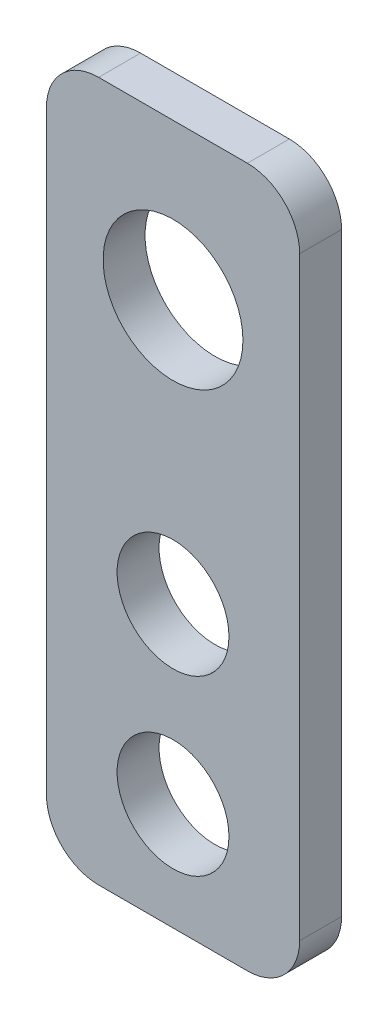
ISO-10303-21;
HEADER;
FILE_DESCRIPTION(('STEP AP214'),'2;1');
FILE_NAME('part.step','',(''),(''),'','','');
FILE_SCHEMA(('AUTOMOTIVE_DESIGN { 1 0 10303 214 1 1 1 1 }'));
ENDSEC;
DATA;
#1=APPLICATION_CONTEXT('core data for automotive mechanical design processes');
#2=APPLICATION_PROTOCOL_DEFINITION('international standard','automotive_design',2000,#1);
#3=PRODUCT_CONTEXT('',#1,'mechanical');
#4=PRODUCT('Part','Part','',(#3));
#5=PRODUCT_RELATED_PRODUCT_CATEGORY('part','',(#4));
#6=PRODUCT_DEFINITION_FORMATION('','',#4);
#7=PRODUCT_DEFINITION_CONTEXT('part definition',#1,'design');
#8=PRODUCT_DEFINITION('design','',#6,#7);
#9=PRODUCT_DEFINITION_SHAPE('','',#8);
#10=(LENGTH_UNIT() NAMED_UNIT(*) SI_UNIT(.MILLI.,.METRE.));
#11=(NAMED_UNIT(*) PLANE_ANGLE_UNIT() SI_UNIT($,.RADIAN.));
#12=(NAMED_UNIT(*) SI_UNIT($,.STERADIAN.) SOLID_ANGLE_UNIT());
#13=UNCERTAINTY_MEASURE_WITH_UNIT(LENGTH_MEASURE(1.E-05),#10,'distance_accuracy_value','');
#14=(GEOMETRIC_REPRESENTATION_CONTEXT(3) GLOBAL_UNCERTAINTY_ASSIGNED_CONTEXT((#13)) GLOBAL_UNIT_ASSIGNED_CONTEXT((#10,
#11,#12)) REPRESENTATION_CONTEXT('',''));
#15=CARTESIAN_POINT('',(0.,0.,0.));
#16=DIRECTION('',(0.,0.,1.));
#17=DIRECTION('',(1.,0.,0.));
#18=AXIS2_PLACEMENT_3D('',#15,#16,#17);
#19=CARTESIAN_POINT('',(-80.4255643742412,100.416603253089,3.));
#20=DIRECTION('',(0.,0.,1.));
#21=DIRECTION('',(1.,0.,0.));
#22=AXIS2_PLACEMENT_3D('',#19,#20,#21);
#23=PLANE('',#22);
#24=CARTESIAN_POINT('',(-75.1060983006785,116.730443274004,3.));
#25=DIRECTION('',(0.,0.,1.));
#26=DIRECTION('',(1.,0.,0.));
#27=AXIS2_PLACEMENT_3D('',#24,#25,#26);
#28=CIRCLE('',#27,4.00000000000001);
#29=CARTESIAN_POINT('',(-71.1060983006785,116.730443274004,3.));
#30=VERTEX_POINT('',#29);
#31=EDGE_CURVE('E213',#30,#30,#28,.T.);
#32=ORIENTED_EDGE('',*,*,#31,.F.);
#33=EDGE_LOOP('',(#32));
#34=FACE_BOUND('',#33,.T.);
#35=CARTESIAN_POINT('',(-80.4255643742412,100.416603253089,3.));
#36=DIRECTION('',(0.,0.,1.));
#37=DIRECTION('',(1.,0.,0.));
#38=AXIS2_PLACEMENT_3D('',#35,#36,#37);
#39=CIRCLE('',#38,3.73635693418524);
#40=CARTESIAN_POINT('',(-84.1619213084264,100.416603253089,3.));
#41=VERTEX_POINT('',#40);
#42=CARTESIAN_POINT('',(-80.4255643742412,96.6802463189038,3.));
#43=VERTEX_POINT('',#42);
#44=EDGE_CURVE('E164',#41,#43,#39,.T.);
#45=ORIENTED_EDGE('',*,*,#44,.T.);
#46=DIRECTION('',(1.,0.,0.));
#47=VECTOR('',#46,1.);
#48=CARTESIAN_POINT('',(-80.4255643742412,96.6802463189038,3.));
#49=LINE('',#48,#47);
#50=CARTESIAN_POINT('',(-69.7866322271158,96.6802463189038,3.));
#51=VERTEX_POINT('',#50);
#52=EDGE_CURVE('E100',#43,#51,#49,.T.);
#53=ORIENTED_EDGE('',*,*,#52,.T.);
#54=CARTESIAN_POINT('',(-69.7866322271158,100.416603253089,3.));
#55=DIRECTION('',(0.,0.,1.));
#56=DIRECTION('',(1.,0.,0.));
#57=AXIS2_PLACEMENT_3D('',#54,#55,#56);
#58=CIRCLE('',#57,3.73635693418525);
#59=CARTESIAN_POINT('',(-66.0502752929305,100.416603253089,3.));
#60=VERTEX_POINT('',#59);
#61=EDGE_CURVE('E185',#51,#60,#58,.T.);
#62=ORIENTED_EDGE('',*,*,#61,.T.);
#63=DIRECTION('',(0.,1.,0.));
#64=VECTOR('',#63,1.);
#65=CARTESIAN_POINT('',(-66.0502752929305,100.416603253089,3.));
#66=LINE('',#65,#64);
#67=CARTESIAN_POINT('',(-66.0502752929305,142.972331841591,3.));
#68=VERTEX_POINT('',#67);
#69=EDGE_CURVE('E199',#60,#68,#66,.T.);
#70=ORIENTED_EDGE('',*,*,#69,.T.);
#71=CARTESIAN_POINT('',(-69.7866322271157,142.972331841591,3.));
#72=DIRECTION('',(0.,0.,1.));
#73=DIRECTION('',(1.,0.,0.));
#74=AXIS2_PLACEMENT_3D('',#71,#72,#73);
#75=CIRCLE('',#74,3.73635693418525);
#76=CARTESIAN_POINT('',(-69.7866322271157,146.708688775776,3.));
#77=VERTEX_POINT('',#76);
#78=EDGE_CURVE('E119',#68,#77,#75,.T.);
#79=ORIENTED_EDGE('',*,*,#78,.T.);
#80=DIRECTION('',(-1.,0.,0.));
#81=VECTOR('',#80,1.);
#82=CARTESIAN_POINT('',(-69.7866322271157,146.708688775776,3.));
#83=LINE('',#82,#81);
#84=CARTESIAN_POINT('',(-80.4255643742411,146.708688775776,3.));
#85=VERTEX_POINT('',#84);
#86=EDGE_CURVE('E113',#77,#85,#83,.T.);
#87=ORIENTED_EDGE('',*,*,#86,.T.);
#88=CARTESIAN_POINT('',(-80.4255643742411,142.972331841591,3.));
#89=DIRECTION('',(0.,0.,1.));
#90=DIRECTION('',(1.,0.,0.));
#91=AXIS2_PLACEMENT_3D('',#88,#89,#90);
#92=CIRCLE('',#91,3.73635693418524);
#93=CARTESIAN_POINT('',(-84.1619213084263,142.972331841591,3.));
#94=VERTEX_POINT('',#93);
#95=EDGE_CURVE('E117',#85,#94,#92,.T.);
#96=ORIENTED_EDGE('',*,*,#95,.T.);
#97=DIRECTION('',(0.,-1.,0.));
#98=VECTOR('',#97,1.);
#99=CARTESIAN_POINT('',(-84.1619213084263,142.972331841591,3.));
#100=LINE('',#99,#98);
#101=EDGE_CURVE('E57',#94,#41,#100,.T.);
#102=ORIENTED_EDGE('',*,*,#101,.T.);
#103=EDGE_LOOP('',(#45,#53,#62,#70,#79,#87,#96,#102));
#104=FACE_BOUND('',#103,.T.);
#105=CARTESIAN_POINT('',(-75.1060983006785,104.343716035827,3.));
#106=DIRECTION('',(0.,0.,1.));
#107=DIRECTION('',(1.,0.,0.));
#108=AXIS2_PLACEMENT_3D('',#105,#106,#107);
#109=CIRCLE('',#108,4.00000000000001);
#110=CARTESIAN_POINT('',(-71.1060983006785,104.343716035827,3.));
#111=VERTEX_POINT('',#110);
#112=EDGE_CURVE('E146',#111,#111,#109,.T.);
#113=ORIENTED_EDGE('',*,*,#112,.F.);
#114=EDGE_LOOP('',(#113));
#115=FACE_BOUND('',#114,.T.);
#116=CARTESIAN_POINT('',(-75.1060983006785,135.579810810361,3.));
#117=DIRECTION('',(0.,0.,1.));
#118=DIRECTION('',(1.,0.,0.));
#119=AXIS2_PLACEMENT_3D('',#116,#117,#118);
#120=CIRCLE('',#119,4.99999999999999);
#121=CARTESIAN_POINT('',(-70.1060983006785,135.579810810361,3.));
#122=VERTEX_POINT('',#121);
#123=EDGE_CURVE('E221',#122,#122,#120,.T.);
#124=ORIENTED_EDGE('',*,*,#123,.F.);
#125=EDGE_LOOP('',(#124));
#126=FACE_BOUND('',#125,.T.);
#127=ADVANCED_FACE('F39',(#34,#104,#115,#126),#23,.T.);
#128=CARTESIAN_POINT('',(-80.4255643742412,100.416603253089,0.));
#129=DIRECTION('',(0.,0.,1.));
#130=DIRECTION('',(1.,0.,0.));
#131=AXIS2_PLACEMENT_3D('',#128,#129,#130);
#132=PLANE('',#131);
#133=CARTESIAN_POINT('',(-80.4255643742412,100.416603253089,0.));
#134=DIRECTION('',(0.,0.,1.));
#135=DIRECTION('',(1.,0.,0.));
#136=AXIS2_PLACEMENT_3D('',#133,#134,#135);
#137=CIRCLE('',#136,3.73635693418524);
#138=CARTESIAN_POINT('',(-84.1619213084264,100.416603253089,0.));
#139=VERTEX_POINT('',#138);
#140=CARTESIAN_POINT('',(-80.4255643742412,96.6802463189038,0.));
#141=VERTEX_POINT('',#140);
#142=EDGE_CURVE('E141',#139,#141,#137,.T.);
#143=ORIENTED_EDGE('',*,*,#142,.F.);
#144=DIRECTION('',(0.,-1.,0.));
#145=VECTOR('',#144,1.);
#146=CARTESIAN_POINT('',(-84.1619213084263,142.972331841591,0.));
#147=LINE('',#146,#145);
#148=CARTESIAN_POINT('',(-84.1619213084263,142.972331841591,0.));
#149=VERTEX_POINT('',#148);
#150=EDGE_CURVE('E92',#149,#139,#147,.T.);
#151=ORIENTED_EDGE('',*,*,#150,.F.);
#152=CARTESIAN_POINT('',(-80.4255643742411,142.972331841591,0.));
#153=DIRECTION('',(0.,0.,1.));
#154=DIRECTION('',(1.,0.,0.));
#155=AXIS2_PLACEMENT_3D('',#152,#153,#154);
#156=CIRCLE('',#155,3.73635693418524);
#157=CARTESIAN_POINT('',(-80.4255643742411,146.708688775776,0.));
#158=VERTEX_POINT('',#157);
#159=EDGE_CURVE('E86',#158,#149,#156,.T.);
#160=ORIENTED_EDGE('',*,*,#159,.F.);
#161=DIRECTION('',(-1.,0.,0.));
#162=VECTOR('',#161,1.);
#163=CARTESIAN_POINT('',(-69.7866322271157,146.708688775776,0.));
#164=LINE('',#163,#162);
#165=CARTESIAN_POINT('',(-69.7866322271157,146.708688775776,0.));
#166=VERTEX_POINT('',#165);
#167=EDGE_CURVE('E128',#166,#158,#164,.T.);
#168=ORIENTED_EDGE('',*,*,#167,.F.);
#169=CARTESIAN_POINT('',(-69.7866322271157,142.972331841591,0.));
#170=DIRECTION('',(0.,0.,1.));
#171=DIRECTION('',(1.,0.,0.));
#172=AXIS2_PLACEMENT_3D('',#169,#170,#171);
#173=CIRCLE('',#172,3.73635693418525);
#174=CARTESIAN_POINT('',(-66.0502752929305,142.972331841591,0.));
#175=VERTEX_POINT('',#174);
#176=EDGE_CURVE('E155',#175,#166,#173,.T.);
#177=ORIENTED_EDGE('',*,*,#176,.F.);
#178=DIRECTION('',(0.,1.,0.));
#179=VECTOR('',#178,1.);
#180=CARTESIAN_POINT('',(-66.0502752929305,100.416603253089,0.));
#181=LINE('',#180,#179);
#182=CARTESIAN_POINT('',(-66.0502752929305,100.416603253089,0.));
#183=VERTEX_POINT('',#182);
#184=EDGE_CURVE('E152',#183,#175,#181,.T.);
#185=ORIENTED_EDGE('',*,*,#184,.F.);
#186=CARTESIAN_POINT('',(-69.7866322271158,100.416603253089,0.));
#187=DIRECTION('',(0.,0.,1.));
#188=DIRECTION('',(1.,0.,0.));
#189=AXIS2_PLACEMENT_3D('',#186,#187,#188);
#190=CIRCLE('',#189,3.73635693418525);
#191=CARTESIAN_POINT('',(-69.7866322271158,96.6802463189038,0.));
#192=VERTEX_POINT('',#191);
#193=EDGE_CURVE('E149',#192,#183,#190,.T.);
#194=ORIENTED_EDGE('',*,*,#193,.F.);
#195=DIRECTION('',(1.,0.,0.));
#196=VECTOR('',#195,1.);
#197=CARTESIAN_POINT('',(-80.4255643742412,96.6802463189038,0.));
#198=LINE('',#197,#196);
#199=EDGE_CURVE('E145',#141,#192,#198,.T.);
#200=ORIENTED_EDGE('',*,*,#199,.F.);
#201=EDGE_LOOP('',(#143,#151,#160,#168,#177,#185,#194,#200));
#202=FACE_BOUND('',#201,.T.);
#203=CARTESIAN_POINT('',(-75.1060983006785,104.343716035827,0.));
#204=DIRECTION('',(0.,0.,1.));
#205=DIRECTION('',(1.,0.,0.));
#206=AXIS2_PLACEMENT_3D('',#203,#204,#205);
#207=CIRCLE('',#206,4.00000000000001);
#208=CARTESIAN_POINT('',(-71.1060983006785,104.343716035827,0.));
#209=VERTEX_POINT('',#208);
#210=EDGE_CURVE('E209',#209,#209,#207,.T.);
#211=ORIENTED_EDGE('',*,*,#210,.T.);
#212=EDGE_LOOP('',(#211));
#213=FACE_BOUND('',#212,.T.);
#214=CARTESIAN_POINT('',(-75.1060983006785,116.730443274004,0.));
#215=DIRECTION('',(0.,0.,1.));
#216=DIRECTION('',(1.,0.,0.));
#217=AXIS2_PLACEMENT_3D('',#214,#215,#216);
#218=CIRCLE('',#217,4.00000000000001);
#219=CARTESIAN_POINT('',(-71.1060983006785,116.730443274004,0.));
#220=VERTEX_POINT('',#219);
#221=EDGE_CURVE('E217',#220,#220,#218,.T.);
#222=ORIENTED_EDGE('',*,*,#221,.T.);
#223=EDGE_LOOP('',(#222));
#224=FACE_BOUND('',#223,.T.);
#225=CARTESIAN_POINT('',(-75.1060983006785,135.579810810361,0.));
#226=DIRECTION('',(0.,0.,1.));
#227=DIRECTION('',(1.,0.,0.));
#228=AXIS2_PLACEMENT_3D('',#225,#226,#227);
#229=CIRCLE('',#228,4.99999999999999);
#230=CARTESIAN_POINT('',(-70.1060983006785,135.579810810361,0.));
#231=VERTEX_POINT('',#230);
#232=EDGE_CURVE('E225',#231,#231,#229,.T.);
#233=ORIENTED_EDGE('',*,*,#232,.T.);
#234=EDGE_LOOP('',(#233));
#235=FACE_BOUND('',#234,.T.);
#236=ADVANCED_FACE('F189',(#202,#213,#224,#235),#132,.F.);
#237=CARTESIAN_POINT('',(-80.4255643742412,100.416603253089,3.));
#238=DIRECTION('',(0.,0.,-1.));
#239=DIRECTION('',(-1.,0.,0.));
#240=AXIS2_PLACEMENT_3D('',#237,#238,#239);
#241=CYLINDRICAL_SURFACE('',#240,3.73635693418524);
#242=ORIENTED_EDGE('',*,*,#142,.T.);
#243=DIRECTION('',(0.,0.,-1.));
#244=VECTOR('',#243,1.);
#245=CARTESIAN_POINT('',(-80.4255643742412,96.6802463189038,3.));
#246=LINE('',#245,#244);
#247=EDGE_CURVE('E11',#43,#141,#246,.T.);
#248=ORIENTED_EDGE('',*,*,#247,.F.);
#249=ORIENTED_EDGE('',*,*,#44,.F.);
#250=DIRECTION('',(0.,0.,-1.));
#251=VECTOR('',#250,1.);
#252=CARTESIAN_POINT('',(-84.1619213084264,100.416603253089,3.));
#253=LINE('',#252,#251);
#254=EDGE_CURVE('E137',#41,#139,#253,.T.);
#255=ORIENTED_EDGE('',*,*,#254,.T.);
#256=EDGE_LOOP('',(#242,#248,#249,#255));
#257=FACE_BOUND('',#256,.T.);
#258=ADVANCED_FACE('F41',(#257),#241,.T.);
#259=CARTESIAN_POINT('',(-80.4255643742412,96.6802463189038,3.));
#260=DIRECTION('',(0.,1.,0.));
#261=DIRECTION('',(-1.,0.,0.));
#262=AXIS2_PLACEMENT_3D('',#259,#260,#261);
#263=PLANE('',#262);
#264=ORIENTED_EDGE('',*,*,#199,.T.);
#265=DIRECTION('',(0.,0.,-1.));
#266=VECTOR('',#265,1.);
#267=CARTESIAN_POINT('',(-69.7866322271158,96.6802463189038,3.));
#268=LINE('',#267,#266);
#269=EDGE_CURVE('E49',#51,#192,#268,.T.);
#270=ORIENTED_EDGE('',*,*,#269,.F.);
#271=ORIENTED_EDGE('',*,*,#52,.F.);
#272=ORIENTED_EDGE('',*,*,#247,.T.);
#273=EDGE_LOOP('',(#264,#270,#271,#272));
#274=FACE_BOUND('',#273,.T.);
#275=ADVANCED_FACE('F260',(#274),#263,.F.);
#276=CARTESIAN_POINT('',(-69.7866322271158,100.416603253089,3.));
#277=DIRECTION('',(0.,0.,-1.));
#278=DIRECTION('',(-1.,0.,0.));
#279=AXIS2_PLACEMENT_3D('',#276,#277,#278);
#280=CYLINDRICAL_SURFACE('',#279,3.73635693418525);
#281=ORIENTED_EDGE('',*,*,#193,.T.);
#282=DIRECTION('',(0.,0.,-1.));
#283=VECTOR('',#282,1.);
#284=CARTESIAN_POINT('',(-66.0502752929305,100.416603253089,3.));
#285=LINE('',#284,#283);
#286=EDGE_CURVE('E175',#60,#183,#285,.T.);
#287=ORIENTED_EDGE('',*,*,#286,.F.);
#288=ORIENTED_EDGE('',*,*,#61,.F.);
#289=ORIENTED_EDGE('',*,*,#269,.T.);
#290=EDGE_LOOP('',(#281,#287,#288,#289));
#291=FACE_BOUND('',#290,.T.);
#292=ADVANCED_FACE('F183',(#291),#280,.T.);
#293=CARTESIAN_POINT('',(-66.0502752929305,100.416603253089,3.));
#294=DIRECTION('',(-1.,0.,0.));
#295=DIRECTION('',(0.,-1.,0.));
#296=AXIS2_PLACEMENT_3D('',#293,#294,#295);
#297=PLANE('',#296);
#298=ORIENTED_EDGE('',*,*,#184,.T.);
#299=DIRECTION('',(0.,0.,-1.));
#300=VECTOR('',#299,1.);
#301=CARTESIAN_POINT('',(-66.0502752929305,142.972331841591,3.));
#302=LINE('',#301,#300);
#303=EDGE_CURVE('E171',#68,#175,#302,.T.);
#304=ORIENTED_EDGE('',*,*,#303,.F.);
#305=ORIENTED_EDGE('',*,*,#69,.F.);
#306=ORIENTED_EDGE('',*,*,#286,.T.);
#307=EDGE_LOOP('',(#298,#304,#305,#306));
#308=FACE_BOUND('',#307,.T.);
#309=ADVANCED_FACE('F194',(#308),#297,.F.);
#310=CARTESIAN_POINT('',(-69.7866322271157,142.972331841591,3.));
#311=DIRECTION('',(0.,0.,-1.));
#312=DIRECTION('',(-1.,0.,0.));
#313=AXIS2_PLACEMENT_3D('',#310,#311,#312);
#314=CYLINDRICAL_SURFACE('',#313,3.73635693418525);
#315=ORIENTED_EDGE('',*,*,#176,.T.);
#316=DIRECTION('',(0.,0.,-1.));
#317=VECTOR('',#316,1.);
#318=CARTESIAN_POINT('',(-69.7866322271157,146.708688775776,3.));
#319=LINE('',#318,#317);
#320=EDGE_CURVE('E130',#77,#166,#319,.T.);
#321=ORIENTED_EDGE('',*,*,#320,.F.);
#322=ORIENTED_EDGE('',*,*,#78,.F.);
#323=ORIENTED_EDGE('',*,*,#303,.T.);
#324=EDGE_LOOP('',(#315,#321,#322,#323));
#325=FACE_BOUND('',#324,.T.);
#326=ADVANCED_FACE('F197',(#325),#314,.T.);
#327=CARTESIAN_POINT('',(-69.7866322271157,146.708688775776,3.));
#328=DIRECTION('',(0.,-1.,0.));
#329=DIRECTION('',(0.,0.,-1.));
#330=AXIS2_PLACEMENT_3D('',#327,#328,#329);
#331=PLANE('',#330);
#332=ORIENTED_EDGE('',*,*,#167,.T.);
#333=DIRECTION('',(0.,0.,-1.));
#334=VECTOR('',#333,1.);
#335=CARTESIAN_POINT('',(-80.4255643742411,146.708688775776,3.));
#336=LINE('',#335,#334);
#337=EDGE_CURVE('E125',#85,#158,#336,.T.);
#338=ORIENTED_EDGE('',*,*,#337,.F.);
#339=ORIENTED_EDGE('',*,*,#86,.F.);
#340=ORIENTED_EDGE('',*,*,#320,.T.);
#341=EDGE_LOOP('',(#332,#338,#339,#340));
#342=FACE_BOUND('',#341,.T.);
#343=ADVANCED_FACE('F126',(#342),#331,.F.);
#344=CARTESIAN_POINT('',(-80.4255643742411,142.972331841591,3.));
#345=DIRECTION('',(0.,0.,-1.));
#346=DIRECTION('',(-1.,0.,0.));
#347=AXIS2_PLACEMENT_3D('',#344,#345,#346);
#348=CYLINDRICAL_SURFACE('',#347,3.73635693418524);
#349=ORIENTED_EDGE('',*,*,#159,.T.);
#350=DIRECTION('',(0.,0.,-1.));
#351=VECTOR('',#350,1.);
#352=CARTESIAN_POINT('',(-84.1619213084263,142.972331841591,3.));
#353=LINE('',#352,#351);
#354=EDGE_CURVE('E131',#94,#149,#353,.T.);
#355=ORIENTED_EDGE('',*,*,#354,.F.);
#356=ORIENTED_EDGE('',*,*,#95,.F.);
#357=ORIENTED_EDGE('',*,*,#337,.T.);
#358=EDGE_LOOP('',(#349,#355,#356,#357));
#359=FACE_BOUND('',#358,.T.);
#360=ADVANCED_FACE('F133',(#359),#348,.T.);
#361=CARTESIAN_POINT('',(-84.1619213084263,142.972331841591,3.));
#362=DIRECTION('',(1.,0.,0.));
#363=DIRECTION('',(0.,1.,0.));
#364=AXIS2_PLACEMENT_3D('',#361,#362,#363);
#365=PLANE('',#364);
#366=ORIENTED_EDGE('',*,*,#150,.T.);
#367=ORIENTED_EDGE('',*,*,#254,.F.);
#368=ORIENTED_EDGE('',*,*,#101,.F.);
#369=ORIENTED_EDGE('',*,*,#354,.T.);
#370=EDGE_LOOP('',(#366,#367,#368,#369));
#371=FACE_BOUND('',#370,.T.);
#372=ADVANCED_FACE('F248',(#371),#365,.F.);
#373=CARTESIAN_POINT('',(-75.1060983006785,104.343716035827,3.));
#374=DIRECTION('',(0.,0.,-1.));
#375=DIRECTION('',(-1.,0.,0.));
#376=AXIS2_PLACEMENT_3D('',#373,#374,#375);
#377=CYLINDRICAL_SURFACE('',#376,4.00000000000001);
#378=ORIENTED_EDGE('',*,*,#112,.T.);
#379=EDGE_LOOP('',(#378));
#380=FACE_BOUND('',#379,.T.);
#381=ORIENTED_EDGE('',*,*,#210,.F.);
#382=EDGE_LOOP('',(#381));
#383=FACE_BOUND('',#382,.T.);
#384=ADVANCED_FACE('F245',(#380,#383),#377,.F.);
#385=CARTESIAN_POINT('',(-75.1060983006785,116.730443274004,3.));
#386=DIRECTION('',(0.,0.,-1.));
#387=DIRECTION('',(-1.,0.,0.));
#388=AXIS2_PLACEMENT_3D('',#385,#386,#387);
#389=CYLINDRICAL_SURFACE('',#388,4.00000000000001);
#390=ORIENTED_EDGE('',*,*,#31,.T.);
#391=EDGE_LOOP('',(#390));
#392=FACE_BOUND('',#391,.T.);
#393=ORIENTED_EDGE('',*,*,#221,.F.);
#394=EDGE_LOOP('',(#393));
#395=FACE_BOUND('',#394,.T.);
#396=ADVANCED_FACE('F324',(#392,#395),#389,.F.);
#397=CARTESIAN_POINT('',(-75.1060983006785,135.579810810361,3.));
#398=DIRECTION('',(0.,0.,-1.));
#399=DIRECTION('',(-1.,0.,0.));
#400=AXIS2_PLACEMENT_3D('',#397,#398,#399);
#401=CYLINDRICAL_SURFACE('',#400,4.99999999999999);
#402=ORIENTED_EDGE('',*,*,#123,.T.);
#403=EDGE_LOOP('',(#402));
#404=FACE_BOUND('',#403,.T.);
#405=ORIENTED_EDGE('',*,*,#232,.F.);
#406=EDGE_LOOP('',(#405));
#407=FACE_BOUND('',#406,.T.);
#408=ADVANCED_FACE('F233',(#404,#407),#401,.F.);
#409=CLOSED_SHELL('',(#127,#236,#258,#275,#292,#309,#326,#343,#360,#372,#384,#396,#408));
#410=MANIFOLD_SOLID_BREP('B2',#409);
#411=ADVANCED_BREP_SHAPE_REPRESENTATION('',(#18,#410),#14);
#412=SHAPE_DEFINITION_REPRESENTATION(#9,#411);
ENDSEC;
END-ISO-10303-21;
